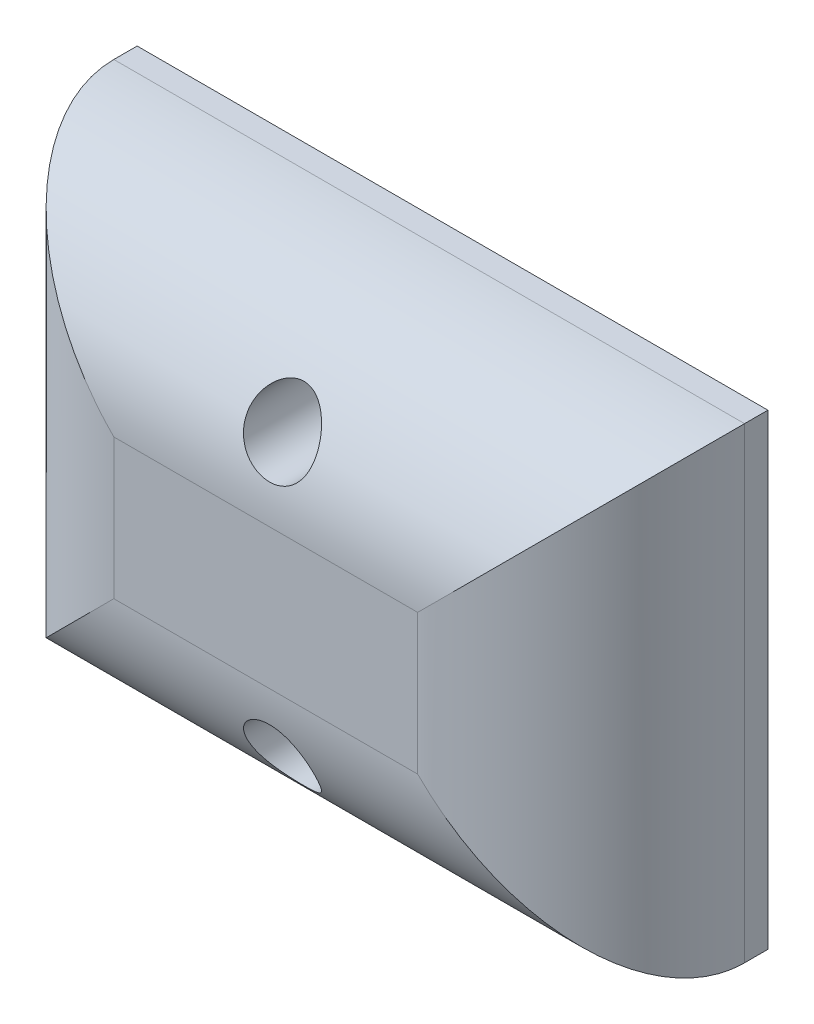
ISO-10303-21;
HEADER;
FILE_DESCRIPTION(('STEP AP214'),'2;1');
FILE_NAME('part.step','',(''),(''),'','','');
FILE_SCHEMA(('AUTOMOTIVE_DESIGN { 1 0 10303 214 1 1 1 1 }'));
ENDSEC;
DATA;
#1=APPLICATION_CONTEXT('core data for automotive mechanical design processes');
#2=APPLICATION_PROTOCOL_DEFINITION('international standard','automotive_design',2000,#1);
#3=PRODUCT_CONTEXT('',#1,'mechanical');
#4=PRODUCT('Part','Part','',(#3));
#5=PRODUCT_RELATED_PRODUCT_CATEGORY('part','',(#4));
#6=PRODUCT_DEFINITION_FORMATION('','',#4);
#7=PRODUCT_DEFINITION_CONTEXT('part definition',#1,'design');
#8=PRODUCT_DEFINITION('design','',#6,#7);
#9=PRODUCT_DEFINITION_SHAPE('','',#8);
#10=(LENGTH_UNIT() NAMED_UNIT(*) SI_UNIT(.MILLI.,.METRE.));
#11=(NAMED_UNIT(*) PLANE_ANGLE_UNIT() SI_UNIT($,.RADIAN.));
#12=(NAMED_UNIT(*) SI_UNIT($,.STERADIAN.) SOLID_ANGLE_UNIT());
#13=UNCERTAINTY_MEASURE_WITH_UNIT(LENGTH_MEASURE(1.E-05),#10,'distance_accuracy_value','');
#14=(GEOMETRIC_REPRESENTATION_CONTEXT(3) GLOBAL_UNCERTAINTY_ASSIGNED_CONTEXT((#13)) GLOBAL_UNIT_ASSIGNED_CONTEXT((#10,
#11,#12)) REPRESENTATION_CONTEXT('',''));
#15=CARTESIAN_POINT('',(0.,0.,0.));
#16=DIRECTION('',(0.,0.,1.));
#17=DIRECTION('',(1.,0.,0.));
#18=AXIS2_PLACEMENT_3D('',#15,#16,#17);
#19=CARTESIAN_POINT('',(67.5347222222222,-50.,40.));
#20=DIRECTION('',(-1.,0.,0.));
#21=DIRECTION('',(0.,0.,1.));
#22=AXIS2_PLACEMENT_3D('',#19,#20,#21);
#23=PLANE('',#22);
#24=DIRECTION('',(0.,1.,0.));
#25=VECTOR('',#24,1.);
#26=CARTESIAN_POINT('',(67.5347222222222,-50.,5.));
#27=LINE('',#26,#25);
#28=CARTESIAN_POINT('',(67.5347222222222,-50.,5.));
#29=VERTEX_POINT('',#28);
#30=CARTESIAN_POINT('',(67.5347222222222,50.,5.));
#31=VERTEX_POINT('',#30);
#32=EDGE_CURVE('E94',#29,#31,#27,.T.);
#33=ORIENTED_EDGE('',*,*,#32,.F.);
#34=DIRECTION('',(0.,0.,-1.));
#35=VECTOR('',#34,1.);
#36=CARTESIAN_POINT('',(67.5347222222222,-50.,40.));
#37=LINE('',#36,#35);
#38=CARTESIAN_POINT('',(67.5347222222222,-50.,0.));
#39=VERTEX_POINT('',#38);
#40=EDGE_CURVE('E60',#29,#39,#37,.T.);
#41=ORIENTED_EDGE('',*,*,#40,.T.);
#42=DIRECTION('',(0.,1.,0.));
#43=VECTOR('',#42,1.);
#44=CARTESIAN_POINT('',(67.5347222222222,-50.,0.));
#45=LINE('',#44,#43);
#46=CARTESIAN_POINT('',(67.5347222222222,50.,0.));
#47=VERTEX_POINT('',#46);
#48=EDGE_CURVE('E193',#39,#47,#45,.T.);
#49=ORIENTED_EDGE('',*,*,#48,.T.);
#50=DIRECTION('',(0.,0.,-1.));
#51=VECTOR('',#50,1.);
#52=CARTESIAN_POINT('',(67.5347222222222,50.,40.));
#53=LINE('',#52,#51);
#54=EDGE_CURVE('E100',#31,#47,#53,.T.);
#55=ORIENTED_EDGE('',*,*,#54,.F.);
#56=EDGE_LOOP('',(#33,#41,#49,#55));
#57=FACE_BOUND('',#56,.T.);
#58=ADVANCED_FACE('F32',(#57),#23,.F.);
#59=CARTESIAN_POINT('',(0.,0.,40.));
#60=DIRECTION('',(0.,0.,1.));
#61=DIRECTION('',(1.,0.,0.));
#62=AXIS2_PLACEMENT_3D('',#59,#60,#61);
#63=PLANE('',#62);
#64=DIRECTION('',(1.,0.,0.));
#65=VECTOR('',#64,1.);
#66=CARTESIAN_POINT('',(-67.5347222222222,-15.,40.));
#67=LINE('',#66,#65);
#68=CARTESIAN_POINT('',(-32.5347222222222,-15.,40.));
#69=VERTEX_POINT('',#68);
#70=CARTESIAN_POINT('',(32.5347222222222,-15.,40.));
#71=VERTEX_POINT('',#70);
#72=EDGE_CURVE('E52',#69,#71,#67,.T.);
#73=ORIENTED_EDGE('',*,*,#72,.T.);
#74=DIRECTION('',(0.,1.,0.));
#75=VECTOR('',#74,1.);
#76=CARTESIAN_POINT('',(32.5347222222222,-50.,40.));
#77=LINE('',#76,#75);
#78=CARTESIAN_POINT('',(32.5347222222222,15.,40.));
#79=VERTEX_POINT('',#78);
#80=EDGE_CURVE('E96',#71,#79,#77,.T.);
#81=ORIENTED_EDGE('',*,*,#80,.T.);
#82=DIRECTION('',(1.,0.,0.));
#83=VECTOR('',#82,1.);
#84=CARTESIAN_POINT('',(-67.5347222222222,15.,40.));
#85=LINE('',#84,#83);
#86=CARTESIAN_POINT('',(-32.5347222222222,15.,40.));
#87=VERTEX_POINT('',#86);
#88=EDGE_CURVE('E191',#87,#79,#85,.T.);
#89=ORIENTED_EDGE('',*,*,#88,.F.);
#90=DIRECTION('',(0.,1.,0.));
#91=VECTOR('',#90,1.);
#92=CARTESIAN_POINT('',(-32.5347222222222,-50.,40.));
#93=LINE('',#92,#91);
#94=EDGE_CURVE('E204',#69,#87,#93,.T.);
#95=ORIENTED_EDGE('',*,*,#94,.F.);
#96=EDGE_LOOP('',(#73,#81,#89,#95));
#97=FACE_BOUND('',#96,.T.);
#98=ADVANCED_FACE('F162',(#97),#63,.T.);
#99=CARTESIAN_POINT('',(-67.5347222222222,15.,5.));
#100=DIRECTION('',(1.,0.,0.));
#101=DIRECTION('',(0.,0.,-1.));
#102=AXIS2_PLACEMENT_3D('',#99,#100,#101);
#103=CYLINDRICAL_SURFACE('',#102,35.);
#104=CARTESIAN_POINT('',(7.5,30.,36.6227766016838));
#105=CARTESIAN_POINT('',(7.49999916443161,29.790232917641,36.7222770861872));
#106=CARTESIAN_POINT('',(7.49119477728935,29.579429460195,36.8197080363041));
#107=CARTESIAN_POINT('',(7.45550013901082,29.1571184853507,37.0098369424833));
#108=CARTESIAN_POINT('',(7.42860193927772,28.945610699192,37.1025327991592));
#109=CARTESIAN_POINT('',(7.35627826191036,28.5231213306105,37.2827819922161));
#110=CARTESIAN_POINT('',(7.31082179021821,28.3121412254244,37.3703264440594));
#111=CARTESIAN_POINT('',(7.20114607772755,27.892758169721,37.5396361787241));
#112=CARTESIAN_POINT('',(7.13692806469736,27.6843550514938,37.6214018392789));
#113=CARTESIAN_POINT('',(6.98943803110547,27.2712637804176,37.7790346209648));
#114=CARTESIAN_POINT('',(6.90610706193821,27.0665892806202,37.8548824996844));
#115=CARTESIAN_POINT('',(6.72065463251747,26.6635330712533,38.0001195363502));
#116=CARTESIAN_POINT('',(6.61853238412301,26.4651516260354,38.0695084232106));
#117=CARTESIAN_POINT('',(6.39596935703217,26.0767826407326,38.2016104730404));
#118=CARTESIAN_POINT('',(6.27554023347453,25.8867898585898,38.2643278405781));
#119=CARTESIAN_POINT('',(6.01697390491499,25.5170426140269,38.3830723749251));
#120=CARTESIAN_POINT('',(5.87883798355347,25.3372874108046,38.4391000261319));
#121=CARTESIAN_POINT('',(5.5955731394145,25.0015470867855,38.5409862376825));
#122=CARTESIAN_POINT('',(5.45152858720825,24.8447762436539,38.5872741732381));
#123=CARTESIAN_POINT('',(5.14974895884271,24.5433005380019,38.6741745081435));
#124=CARTESIAN_POINT('',(4.99201431695489,24.3985952930267,38.7147870874179));
#125=CARTESIAN_POINT('',(4.66397559289687,24.1226478552546,38.7904982778066));
#126=CARTESIAN_POINT('',(4.49367279987639,23.9914042849481,38.8255974532935));
#127=CARTESIAN_POINT('',(4.14173842623571,23.7436182199206,38.8904935203734));
#128=CARTESIAN_POINT('',(3.96010708482611,23.6270754149391,38.9202905238745));
#129=CARTESIAN_POINT('',(3.59476807363196,23.4143774597845,38.9736628571047));
#130=CARTESIAN_POINT('',(3.41147008271662,23.317570343925,38.9974473794923));
#131=CARTESIAN_POINT('',(3.03706013813732,23.1392964148022,39.0405679979049));
#132=CARTESIAN_POINT('',(2.84594839053682,23.0578291973141,39.0599042111511));
#133=CARTESIAN_POINT('',(2.45730268780749,22.9109367870957,39.0943217265486));
#134=CARTESIAN_POINT('',(2.25976922896498,22.8455103580144,39.1094033566373));
#135=CARTESIAN_POINT('',(1.85969742232592,22.7312447051172,39.1354843764716));
#136=CARTESIAN_POINT('',(1.65715906867952,22.68240550069,39.1464837614455));
#137=CARTESIAN_POINT('',(1.25078967377641,22.602165886026,39.164436871357));
#138=CARTESIAN_POINT('',(1.04699702495568,22.5705805122818,39.1714335459592));
#139=CARTESIAN_POINT('',(0.637338439895402,22.524285672601,39.1816572024937));
#140=CARTESIAN_POINT('',(0.43147181488207,22.5095820129078,39.1848828874507));
#141=CARTESIAN_POINT('',(0.0192407242948251,22.4971909092291,39.187602563217));
#142=CARTESIAN_POINT('',(-0.187123642553708,22.4995003302239,39.1870972415431));
#143=CARTESIAN_POINT('',(-0.598917994469745,22.5211092100523,39.1823498020761));
#144=CARTESIAN_POINT('',(-0.804347978974192,22.5404086791227,39.1781076820317));
#145=CARTESIAN_POINT('',(-1.21257496973654,22.59580910117,39.1658379994476));
#146=CARTESIAN_POINT('',(-1.41537472600675,22.6318907554921,39.1578147848337));
#147=CARTESIAN_POINT('',(-1.8171451317034,22.7205560232521,39.1378833074107));
#148=CARTESIAN_POINT('',(-2.01611568368387,22.7731400560564,39.1259749458701));
#149=CARTESIAN_POINT('',(-2.40880464563198,22.8943765555221,39.0981331353639));
#150=CARTESIAN_POINT('',(-2.60252319417469,22.9630285977648,39.0821997927128));
#151=CARTESIAN_POINT('',(-2.98333795699351,23.1158308167833,39.0461370424751));
#152=CARTESIAN_POINT('',(-3.17043434761737,23.1999805804848,39.026007746725));
#153=CARTESIAN_POINT('',(-3.53677815338835,23.3831158842529,38.9813514994481));
#154=CARTESIAN_POINT('',(-3.71602200346857,23.4821080744329,38.9568225757066));
#155=CARTESIAN_POINT('',(-4.06532771428671,23.6940626780297,38.9031741697423));
#156=CARTESIAN_POINT('',(-4.2353895243249,23.807025168574,38.8740546621755));
#157=CARTESIAN_POINT('',(-4.56519402027287,24.0459698806125,38.8110291286595));
#158=CARTESIAN_POINT('',(-4.72493548960455,24.1719536325393,38.7771225398968));
#159=CARTESIAN_POINT('',(-5.03297605170879,24.435805044694,38.704366159004));
#160=CARTESIAN_POINT('',(-5.18127894445742,24.5736687258205,38.6655180199526));
#161=CARTESIAN_POINT('',(-5.46648316531185,24.8610502222671,38.5824685686632));
#162=CARTESIAN_POINT('',(-5.60330578241188,25.0106367290142,38.5382347091576));
#163=CARTESIAN_POINT('',(-5.86368242275903,25.3194004219109,38.4445212019187));
#164=CARTESIAN_POINT('',(-5.98723644683927,25.4785776074583,38.3950415545148));
#165=CARTESIAN_POINT('',(-6.2204105983893,25.8051529136064,38.2908101330523));
#166=CARTESIAN_POINT('',(-6.33003278076222,25.9725498167631,38.2360591385996));
#167=CARTESIAN_POINT('',(-6.53491254501008,26.3142678457131,38.1212898024438));
#168=CARTESIAN_POINT('',(-6.63016495935619,26.4885914340835,38.061269578083));
#169=CARTESIAN_POINT('',(-6.808349706438,26.8475993618755,37.9343531965233));
#170=CARTESIAN_POINT('',(-6.89087106291851,27.0324367958612,37.8673133130962));
#171=CARTESIAN_POINT('',(-7.04019217995104,27.4064952373109,37.7279502436963));
#172=CARTESIAN_POINT('',(-7.10698620433037,27.5957178165995,37.6556251426289));
#173=CARTESIAN_POINT('',(-7.22477824433963,27.9770338490029,37.5059768348536));
#174=CARTESIAN_POINT('',(-7.27577880170447,28.1691268349448,37.4286544348139));
#175=CARTESIAN_POINT('',(-7.36212604631513,28.5549394550415,37.2692920623234));
#176=CARTESIAN_POINT('',(-7.39746681186241,28.7486596763625,37.1872503184953));
#177=CARTESIAN_POINT('',(-7.45453469940997,29.1493839849127,37.0132119343324));
#178=CARTESIAN_POINT('',(-7.47519480723372,29.3564110606075,36.9209163926836));
#179=CARTESIAN_POINT('',(-7.4993146081195,29.7694792168684,36.7319116328313));
#180=CARTESIAN_POINT('',(-7.50276786620895,29.9755198997721,36.6352007770431));
#181=CARTESIAN_POINT('',(-7.4879535639881,30.5901992680037,36.3392995639215));
#182=CARTESIAN_POINT('',(-7.44454698871759,30.9956515678299,36.134229307373));
#183=CARTESIAN_POINT('',(-7.28716758468246,31.828938788763,35.6925319178926));
#184=CARTESIAN_POINT('',(-7.16651112785869,32.254899080194,35.4548093387301));
#185=CARTESIAN_POINT('',(-6.85375771715775,33.0772732256766,34.9739718818209));
#186=CARTESIAN_POINT('',(-6.66159114585757,33.4736578339015,34.7308519671944));
#187=CARTESIAN_POINT('',(-6.31344085963727,34.0555421455214,34.3589129792686));
#188=CARTESIAN_POINT('',(-6.18107725959003,34.2546079570394,34.2286507084729));
#189=CARTESIAN_POINT('',(-5.89694840278302,34.6404072815291,33.9708148350706));
#190=CARTESIAN_POINT('',(-5.74518011686715,34.8271388621566,33.8432416558725));
#191=CARTESIAN_POINT('',(-5.4227773317748,35.1866879029053,33.5927546149269));
#192=CARTESIAN_POINT('',(-5.25215651887567,35.3595153014986,33.4698374589938));
#193=CARTESIAN_POINT('',(-4.892484886805,35.6897494119127,33.2307610074462));
#194=CARTESIAN_POINT('',(-4.70344050714011,35.8471614734929,33.114599373111));
#195=CARTESIAN_POINT('',(-4.21042451684359,36.2175567023365,32.8368753134688));
#196=CARTESIAN_POINT('',(-3.89532024533392,36.4202677111757,32.68075404542));
#197=CARTESIAN_POINT('',(-3.39534729209162,36.6901071369297,32.4691180542504));
#198=CARTESIAN_POINT('',(-3.22418972935859,36.7743299012599,32.4023462499716));
#199=CARTESIAN_POINT('',(-2.87322348320654,36.9304704304036,32.2775442764461));
#200=CARTESIAN_POINT('',(-2.69341606410065,37.0023899865661,32.2195128347488));
#201=CARTESIAN_POINT('',(-2.35485879345302,37.1226177467919,32.1218513415607));
#202=CARTESIAN_POINT('',(-2.19721258774929,37.1728595064197,32.0807628260732));
#203=CARTESIAN_POINT('',(-1.87720884141474,37.2631749221628,32.0065632704373));
#204=CARTESIAN_POINT('',(-1.71485220520355,37.3032505160082,31.9734507100865));
#205=CARTESIAN_POINT('',(-1.38641028422054,37.3726539187469,31.9159133883313));
#206=CARTESIAN_POINT('',(-1.22032665462654,37.4019864022466,31.8914848484205));
#207=CARTESIAN_POINT('',(-0.885467423177314,37.4494657591367,31.8518611492105));
#208=CARTESIAN_POINT('',(-0.716691794452796,37.4676125208088,31.8366660821314));
#209=CARTESIAN_POINT('',(-0.377171163347543,37.4924497819561,31.8158529430957));
#210=CARTESIAN_POINT('',(-0.206421638674256,37.499104097779,31.8102651195302));
#211=CARTESIAN_POINT('',(0.135172446892783,37.5007266863555,31.8089033690546));
#212=CARTESIAN_POINT('',(0.306017007857122,37.4956949504179,31.8131294494434));
#213=CARTESIAN_POINT('',(0.646463046818444,37.4740338963568,31.8312876640555));
#214=CARTESIAN_POINT('',(0.816064393443346,37.4574033699299,31.8452208095117));
#215=CARTESIAN_POINT('',(1.15272298271938,37.4128312034541,31.8824447766232));
#216=CARTESIAN_POINT('',(1.31978023494353,37.3848896059779,31.9057355630581));
#217=CARTESIAN_POINT('',(1.64274621357672,37.3196503541866,31.9598760227467));
#218=CARTESIAN_POINT('',(1.79881762581366,37.2828324475107,31.9903366389522));
#219=CARTESIAN_POINT('',(2.10678151171228,37.1997880128894,32.0586825656671));
#220=CARTESIAN_POINT('',(2.25867268943271,37.1535586037055,32.0965701497372));
#221=CARTESIAN_POINT('',(2.70708506010592,37.0015102703514,32.2204084625814));
#222=CARTESIAN_POINT('',(2.99643769670081,36.8823121197214,32.3165508729344));
#223=CARTESIAN_POINT('',(3.46487229020137,36.6550643618758,32.4967662227107));
#224=CARTESIAN_POINT('',(3.650218948282,36.5551153299399,32.5752643695838));
#225=CARTESIAN_POINT('',(4.00920347042456,36.3419094513695,32.7406037417757));
#226=CARTESIAN_POINT('',(4.18284110444914,36.2286523434021,32.827445130926));
#227=CARTESIAN_POINT('',(4.5180716759399,35.9899448307188,33.0079383876454));
#228=CARTESIAN_POINT('',(4.67965026226169,35.8644802946155,33.1015981158236));
#229=CARTESIAN_POINT('',(4.99021042914277,35.6025940580049,33.2941618721999));
#230=CARTESIAN_POINT('',(5.13919289380484,35.4661731278231,33.3930655315402));
#231=CARTESIAN_POINT('',(5.57056066929332,35.0382805566602,33.6982690845827));
#232=CARTESIAN_POINT('',(5.8332814497193,34.7311206251647,33.9108072261044));
#233=CARTESIAN_POINT('',(6.3044970332695,34.0821837255788,34.3431832420776));
#234=CARTESIAN_POINT('',(6.51295967689173,33.7403863934263,34.5630253590445));
#235=CARTESIAN_POINT('',(6.79897990936739,33.1747534627324,34.9121933606278));
#236=CARTESIAN_POINT('',(6.89512734615897,32.9601659366833,35.0415890090888));
#237=CARTESIAN_POINT('',(7.06711623439328,32.5221469139376,35.2991557221818));
#238=CARTESIAN_POINT('',(7.14295235124508,32.2987131114954,35.4273264565938));
#239=CARTESIAN_POINT('',(7.27337186342945,31.844908054132,35.6808819434673));
#240=CARTESIAN_POINT('',(7.32800271612051,31.6145535482181,35.8062723179171));
#241=CARTESIAN_POINT('',(7.41542266733173,31.1479467731451,36.0533960678856));
#242=CARTESIAN_POINT('',(7.44822607243486,30.9116984725901,36.1751317887406));
#243=CARTESIAN_POINT('',(7.47975528311974,30.5619401166865,36.3503042738552));
#244=CARTESIAN_POINT('',(7.48732562983698,30.450086989249,36.4055792338376));
#245=CARTESIAN_POINT('',(7.49744868611085,30.225589488853,36.515028460384));
#246=CARTESIAN_POINT('',(7.50000044989541,30.1129449707671,36.569202517575));
#247=CARTESIAN_POINT('',(7.5,30.,36.6227766016838));
#248=B_SPLINE_CURVE_WITH_KNOTS('',3,(#104,#105,#106,#107,#108,#109,#110,#111,#112,#113,#114,
#115,#116,#117,#118,#119,#120,#121,#122,#123,#124,#125,#126,#127,#128,#129,#130,#131,#132,#133,
#134,#135,#136,#137,#138,#139,#140,#141,#142,#143,#144,#145,#146,#147,#148,#149,#150,#151,#152,
#153,#154,#155,#156,#157,#158,#159,#160,#161,#162,#163,#164,#165,#166,#167,#168,#169,#170,#171,
#172,#173,#174,#175,#176,#177,#178,#179,#180,#181,#182,#183,#184,#185,#186,#187,#188,#189,#190,
#191,#192,#193,#194,#195,#196,#197,#198,#199,#200,#201,#202,#203,#204,#205,#206,#207,#208,#209,
#210,#211,#212,#213,#214,#215,#216,#217,#218,#219,#220,#221,#222,#223,#224,#225,#226,#227,#228,
#229,#230,#231,#232,#233,#234,#235,#236,#237,#238,#239,#240,#241,#242,#243,#244,#245,#246,#247),
.UNSPECIFIED.,.T.,.F.,(4,2,2,2,2,2,2,2,2,2,2,2,2,2,2,2,2,2,2,2,2,2,2,2,2,2,2,2,2,2,2,2,2,2,2,2,
2,2,2,2,2,2,2,2,2,2,2,2,2,2,2,2,2,2,2,2,2,2,2,2,2,2,2,2,2,2,2,2,2,2,2,4),(0.,0.696404120689823,
1.39311437109538,2.09099298416344,2.78882593779492,3.48884081514133,4.1888850591008,
4.88848546962594,5.58803519182183,6.24083183846742,6.89360778492543,7.54631686717971,
8.19901217166646,8.82421622140558,9.44940379395853,10.0745431647358,10.6996832662278,
11.3179832523498,11.9364958309719,12.5548944384262,13.1732934184769,13.7909830228659,
14.4086883255507,15.0263773140749,15.6440498411764,16.2619999465567,16.8799534636731,
17.4979796937121,18.1157997187576,18.7375582957506,19.3593168337041,19.9809835575184,
20.6028733094284,21.2418699654927,21.8810993207231,22.5202257475111,23.159593652023,
23.8416686757023,24.5239987608778,25.8878231191662,27.3893766769037,28.8923958865571,
29.7082995109867,30.524330657391,31.3397732382974,32.1549318165125,33.3670895144712,
33.9728220283266,34.5784662722349,35.0894086334178,35.6002535327261,36.1108758853238,
36.6215033377218,37.1337355756253,37.64596819449,38.1582541831335,38.6705382436523,
39.1596770646722,39.6489658565046,40.6272585789362,41.3007002682728,41.9741551842995,
42.648399186891,43.3225958259582,44.6873645502451,46.0529403579994,46.8573181502219,
47.661906998543,48.4646846502629,49.2669356097111,49.6418301044354,50.0167952427635),.UNSPECIFIED.);
#249=CARTESIAN_POINT('',(7.5,30.,36.6227766016838));
#250=VERTEX_POINT('',#249);
#251=EDGE_CURVE('E35',#250,#250,#248,.T.);
#252=ORIENTED_EDGE('',*,*,#251,.T.);
#253=EDGE_LOOP('',(#252));
#254=FACE_BOUND('',#253,.T.);
#255=CARTESIAN_POINT('',(32.5347222222222,15.,5.));
#256=DIRECTION('',(0.707106781186547,-0.707106781186547,0.));
#257=DIRECTION('',(0.707106781186547,0.707106781186547,0.));
#258=AXIS2_PLACEMENT_3D('',#255,#256,#257);
#259=ELLIPSE('',#258,49.4974746830583,35.);
#260=EDGE_CURVE('E101',#31,#79,#259,.T.);
#261=ORIENTED_EDGE('',*,*,#260,.F.);
#262=DIRECTION('',(1.,0.,0.));
#263=VECTOR('',#262,1.);
#264=CARTESIAN_POINT('',(-67.5347222222222,50.,5.));
#265=LINE('',#264,#263);
#266=CARTESIAN_POINT('',(-67.5347222222222,50.,5.));
#267=VERTEX_POINT('',#266);
#268=EDGE_CURVE('E109',#267,#31,#265,.T.);
#269=ORIENTED_EDGE('',*,*,#268,.F.);
#270=CARTESIAN_POINT('',(-32.5347222222222,15.,5.));
#271=DIRECTION('',(0.707106781186547,0.707106781186547,0.));
#272=DIRECTION('',(0.707106781186547,-0.707106781186547,0.));
#273=AXIS2_PLACEMENT_3D('',#270,#271,#272);
#274=ELLIPSE('',#273,49.4974746830583,35.);
#275=EDGE_CURVE('E206',#267,#87,#274,.T.);
#276=ORIENTED_EDGE('',*,*,#275,.T.);
#277=ORIENTED_EDGE('',*,*,#88,.T.);
#278=EDGE_LOOP('',(#261,#269,#276,#277));
#279=FACE_BOUND('',#278,.T.);
#280=ADVANCED_FACE('F166',(#254,#279),#103,.T.);
#281=CARTESIAN_POINT('',(-67.5347222222222,-15.,5.));
#282=DIRECTION('',(1.,0.,0.));
#283=DIRECTION('',(0.,0.,-1.));
#284=AXIS2_PLACEMENT_3D('',#281,#282,#283);
#285=CYLINDRICAL_SURFACE('',#284,35.);
#286=CARTESIAN_POINT('',(7.5,-30.,36.6227766016838));
#287=CARTESIAN_POINT('',(7.49999916443161,-29.790232917641,36.7222770861872));
#288=CARTESIAN_POINT('',(7.49119477728935,-29.579429460195,36.8197080363041));
#289=CARTESIAN_POINT('',(7.45550013901082,-29.1571184853507,37.0098369424833));
#290=CARTESIAN_POINT('',(7.42860193927772,-28.945610699192,37.1025327991592));
#291=CARTESIAN_POINT('',(7.35627826191036,-28.5231213306105,37.2827819922161));
#292=CARTESIAN_POINT('',(7.31082179021821,-28.3121412254244,37.3703264440594));
#293=CARTESIAN_POINT('',(7.20114607772755,-27.892758169721,37.5396361787241));
#294=CARTESIAN_POINT('',(7.13692806469736,-27.6843550514938,37.6214018392789));
#295=CARTESIAN_POINT('',(6.98943803110547,-27.2712637804176,37.7790346209648));
#296=CARTESIAN_POINT('',(6.90610706193821,-27.0665892806202,37.8548824996844));
#297=CARTESIAN_POINT('',(6.72065463251747,-26.6635330712533,38.0001195363502));
#298=CARTESIAN_POINT('',(6.61853238412301,-26.4651516260354,38.0695084232106));
#299=CARTESIAN_POINT('',(6.39596935703217,-26.0767826407326,38.2016104730404));
#300=CARTESIAN_POINT('',(6.27554023347453,-25.8867898585898,38.2643278405781));
#301=CARTESIAN_POINT('',(6.01697390491499,-25.5170426140269,38.3830723749251));
#302=CARTESIAN_POINT('',(5.87883798355347,-25.3372874108046,38.4391000261319));
#303=CARTESIAN_POINT('',(5.5955731394145,-25.0015470867855,38.5409862376825));
#304=CARTESIAN_POINT('',(5.45152858720825,-24.8447762436539,38.5872741732381));
#305=CARTESIAN_POINT('',(5.14974895884271,-24.5433005380019,38.6741745081435));
#306=CARTESIAN_POINT('',(4.99201431695489,-24.3985952930267,38.7147870874179));
#307=CARTESIAN_POINT('',(4.66397559289687,-24.1226478552546,38.7904982778066));
#308=CARTESIAN_POINT('',(4.49367279987639,-23.9914042849481,38.8255974532935));
#309=CARTESIAN_POINT('',(4.14173842623571,-23.7436182199206,38.8904935203734));
#310=CARTESIAN_POINT('',(3.96010708482611,-23.6270754149391,38.9202905238745));
#311=CARTESIAN_POINT('',(3.59476807363196,-23.4143774597845,38.9736628571047));
#312=CARTESIAN_POINT('',(3.41147008271662,-23.317570343925,38.9974473794923));
#313=CARTESIAN_POINT('',(3.03706013813732,-23.1392964148022,39.0405679979049));
#314=CARTESIAN_POINT('',(2.84594839053682,-23.0578291973141,39.0599042111511));
#315=CARTESIAN_POINT('',(2.45730268780749,-22.9109367870957,39.0943217265486));
#316=CARTESIAN_POINT('',(2.25976922896498,-22.8455103580144,39.1094033566373));
#317=CARTESIAN_POINT('',(1.85969742232592,-22.7312447051172,39.1354843764716));
#318=CARTESIAN_POINT('',(1.65715906867952,-22.68240550069,39.1464837614455));
#319=CARTESIAN_POINT('',(1.25078967377641,-22.602165886026,39.164436871357));
#320=CARTESIAN_POINT('',(1.04699702495568,-22.5705805122818,39.1714335459592));
#321=CARTESIAN_POINT('',(0.637338439895402,-22.524285672601,39.1816572024937));
#322=CARTESIAN_POINT('',(0.43147181488207,-22.5095820129078,39.1848828874507));
#323=CARTESIAN_POINT('',(0.0192407242948251,-22.4971909092291,39.187602563217));
#324=CARTESIAN_POINT('',(-0.187123642553708,-22.4995003302239,39.1870972415431));
#325=CARTESIAN_POINT('',(-0.598917994469745,-22.5211092100523,39.1823498020761));
#326=CARTESIAN_POINT('',(-0.804347978974192,-22.5404086791227,39.1781076820317));
#327=CARTESIAN_POINT('',(-1.21257496973654,-22.59580910117,39.1658379994476));
#328=CARTESIAN_POINT('',(-1.41537472600675,-22.6318907554921,39.1578147848337));
#329=CARTESIAN_POINT('',(-1.8171451317034,-22.7205560232521,39.1378833074107));
#330=CARTESIAN_POINT('',(-2.01611568368387,-22.7731400560564,39.1259749458701));
#331=CARTESIAN_POINT('',(-2.40880464563198,-22.8943765555221,39.0981331353639));
#332=CARTESIAN_POINT('',(-2.60252319417469,-22.9630285977648,39.0821997927128));
#333=CARTESIAN_POINT('',(-2.98333795699351,-23.1158308167833,39.0461370424751));
#334=CARTESIAN_POINT('',(-3.17043434761737,-23.1999805804848,39.026007746725));
#335=CARTESIAN_POINT('',(-3.53677815338835,-23.3831158842529,38.9813514994481));
#336=CARTESIAN_POINT('',(-3.71602200346857,-23.4821080744329,38.9568225757066));
#337=CARTESIAN_POINT('',(-4.06532771428671,-23.6940626780297,38.9031741697423));
#338=CARTESIAN_POINT('',(-4.2353895243249,-23.807025168574,38.8740546621755));
#339=CARTESIAN_POINT('',(-4.56519402027287,-24.0459698806125,38.8110291286595));
#340=CARTESIAN_POINT('',(-4.72493548960455,-24.1719536325393,38.7771225398968));
#341=CARTESIAN_POINT('',(-5.03297605170879,-24.435805044694,38.704366159004));
#342=CARTESIAN_POINT('',(-5.18127894445742,-24.5736687258205,38.6655180199526));
#343=CARTESIAN_POINT('',(-5.46648316531185,-24.8610502222671,38.5824685686632));
#344=CARTESIAN_POINT('',(-5.60330578241188,-25.0106367290142,38.5382347091576));
#345=CARTESIAN_POINT('',(-5.86368242275903,-25.3194004219109,38.4445212019187));
#346=CARTESIAN_POINT('',(-5.98723644683927,-25.4785776074583,38.3950415545148));
#347=CARTESIAN_POINT('',(-6.2204105983893,-25.8051529136064,38.2908101330523));
#348=CARTESIAN_POINT('',(-6.33003278076222,-25.9725498167631,38.2360591385996));
#349=CARTESIAN_POINT('',(-6.53491254501008,-26.3142678457131,38.1212898024438));
#350=CARTESIAN_POINT('',(-6.63016495935619,-26.4885914340835,38.061269578083));
#351=CARTESIAN_POINT('',(-6.808349706438,-26.8475993618755,37.9343531965233));
#352=CARTESIAN_POINT('',(-6.89087106291851,-27.0324367958612,37.8673133130962));
#353=CARTESIAN_POINT('',(-7.04019217995104,-27.4064952373109,37.7279502436963));
#354=CARTESIAN_POINT('',(-7.10698620433037,-27.5957178165995,37.6556251426289));
#355=CARTESIAN_POINT('',(-7.22477824433963,-27.9770338490029,37.5059768348536));
#356=CARTESIAN_POINT('',(-7.27577880170447,-28.1691268349448,37.4286544348139));
#357=CARTESIAN_POINT('',(-7.36212604631513,-28.5549394550415,37.2692920623234));
#358=CARTESIAN_POINT('',(-7.39746681186241,-28.7486596763625,37.1872503184953));
#359=CARTESIAN_POINT('',(-7.45453469940997,-29.1493839849127,37.0132119343324));
#360=CARTESIAN_POINT('',(-7.47519480723372,-29.3564110606075,36.9209163926836));
#361=CARTESIAN_POINT('',(-7.4993146081195,-29.7694792168684,36.7319116328313));
#362=CARTESIAN_POINT('',(-7.50276786620895,-29.9755198997721,36.6352007770431));
#363=CARTESIAN_POINT('',(-7.4879535639881,-30.5901992680037,36.3392995639215));
#364=CARTESIAN_POINT('',(-7.44454698871759,-30.9956515678299,36.134229307373));
#365=CARTESIAN_POINT('',(-7.28716758468246,-31.828938788763,35.6925319178926));
#366=CARTESIAN_POINT('',(-7.16651112785869,-32.254899080194,35.4548093387301));
#367=CARTESIAN_POINT('',(-6.85375771715775,-33.0772732256766,34.9739718818209));
#368=CARTESIAN_POINT('',(-6.66159114585757,-33.4736578339015,34.7308519671944));
#369=CARTESIAN_POINT('',(-6.31344085963727,-34.0555421455214,34.3589129792686));
#370=CARTESIAN_POINT('',(-6.18107725959003,-34.2546079570394,34.2286507084729));
#371=CARTESIAN_POINT('',(-5.89694840278302,-34.6404072815291,33.9708148350706));
#372=CARTESIAN_POINT('',(-5.74518011686715,-34.8271388621566,33.8432416558725));
#373=CARTESIAN_POINT('',(-5.4227773317748,-35.1866879029053,33.5927546149269));
#374=CARTESIAN_POINT('',(-5.25215651887567,-35.3595153014986,33.4698374589938));
#375=CARTESIAN_POINT('',(-4.892484886805,-35.6897494119127,33.2307610074462));
#376=CARTESIAN_POINT('',(-4.70344050714011,-35.8471614734929,33.114599373111));
#377=CARTESIAN_POINT('',(-4.21042451684359,-36.2175567023365,32.8368753134688));
#378=CARTESIAN_POINT('',(-3.89532024533392,-36.4202677111757,32.68075404542));
#379=CARTESIAN_POINT('',(-3.39534729209162,-36.6901071369297,32.4691180542504));
#380=CARTESIAN_POINT('',(-3.22418972935859,-36.7743299012599,32.4023462499716));
#381=CARTESIAN_POINT('',(-2.87322348320654,-36.9304704304036,32.2775442764461));
#382=CARTESIAN_POINT('',(-2.69341606410065,-37.0023899865661,32.2195128347488));
#383=CARTESIAN_POINT('',(-2.35485879345302,-37.1226177467919,32.1218513415607));
#384=CARTESIAN_POINT('',(-2.19721258774929,-37.1728595064197,32.0807628260732));
#385=CARTESIAN_POINT('',(-1.87720884141474,-37.2631749221628,32.0065632704373));
#386=CARTESIAN_POINT('',(-1.71485220520355,-37.3032505160082,31.9734507100865));
#387=CARTESIAN_POINT('',(-1.38641028422054,-37.3726539187469,31.9159133883313));
#388=CARTESIAN_POINT('',(-1.22032665462654,-37.4019864022466,31.8914848484205));
#389=CARTESIAN_POINT('',(-0.885467423177314,-37.4494657591367,31.8518611492105));
#390=CARTESIAN_POINT('',(-0.716691794452796,-37.4676125208088,31.8366660821314));
#391=CARTESIAN_POINT('',(-0.377171163347543,-37.4924497819561,31.8158529430957));
#392=CARTESIAN_POINT('',(-0.206421638674256,-37.499104097779,31.8102651195302));
#393=CARTESIAN_POINT('',(0.135172446892783,-37.5007266863555,31.8089033690546));
#394=CARTESIAN_POINT('',(0.306017007857122,-37.4956949504179,31.8131294494434));
#395=CARTESIAN_POINT('',(0.646463046818444,-37.4740338963568,31.8312876640555));
#396=CARTESIAN_POINT('',(0.816064393443346,-37.4574033699299,31.8452208095117));
#397=CARTESIAN_POINT('',(1.15272298271938,-37.4128312034541,31.8824447766232));
#398=CARTESIAN_POINT('',(1.31978023494353,-37.3848896059779,31.9057355630581));
#399=CARTESIAN_POINT('',(1.64274621357672,-37.3196503541866,31.9598760227467));
#400=CARTESIAN_POINT('',(1.79881762581366,-37.2828324475107,31.9903366389522));
#401=CARTESIAN_POINT('',(2.10678151171228,-37.1997880128894,32.0586825656671));
#402=CARTESIAN_POINT('',(2.25867268943271,-37.1535586037055,32.0965701497372));
#403=CARTESIAN_POINT('',(2.70708506010592,-37.0015102703514,32.2204084625814));
#404=CARTESIAN_POINT('',(2.99643769670081,-36.8823121197214,32.3165508729344));
#405=CARTESIAN_POINT('',(3.46487229020137,-36.6550643618758,32.4967662227107));
#406=CARTESIAN_POINT('',(3.650218948282,-36.5551153299399,32.5752643695838));
#407=CARTESIAN_POINT('',(4.00920347042456,-36.3419094513695,32.7406037417757));
#408=CARTESIAN_POINT('',(4.18284110444914,-36.2286523434021,32.827445130926));
#409=CARTESIAN_POINT('',(4.5180716759399,-35.9899448307188,33.0079383876454));
#410=CARTESIAN_POINT('',(4.67965026226169,-35.8644802946155,33.1015981158236));
#411=CARTESIAN_POINT('',(4.99021042914277,-35.6025940580049,33.2941618721999));
#412=CARTESIAN_POINT('',(5.13919289380484,-35.4661731278231,33.3930655315402));
#413=CARTESIAN_POINT('',(5.57056066929332,-35.0382805566602,33.6982690845827));
#414=CARTESIAN_POINT('',(5.8332814497193,-34.7311206251647,33.9108072261044));
#415=CARTESIAN_POINT('',(6.3044970332695,-34.0821837255788,34.3431832420776));
#416=CARTESIAN_POINT('',(6.51295967689173,-33.7403863934263,34.5630253590445));
#417=CARTESIAN_POINT('',(6.79897990936739,-33.1747534627324,34.9121933606278));
#418=CARTESIAN_POINT('',(6.89512734615897,-32.9601659366833,35.0415890090888));
#419=CARTESIAN_POINT('',(7.06711623439328,-32.5221469139376,35.2991557221818));
#420=CARTESIAN_POINT('',(7.14295235124508,-32.2987131114954,35.4273264565938));
#421=CARTESIAN_POINT('',(7.27337186342945,-31.844908054132,35.6808819434673));
#422=CARTESIAN_POINT('',(7.32800271612051,-31.6145535482181,35.8062723179171));
#423=CARTESIAN_POINT('',(7.41542266733173,-31.1479467731451,36.0533960678856));
#424=CARTESIAN_POINT('',(7.44822607243486,-30.9116984725901,36.1751317887406));
#425=CARTESIAN_POINT('',(7.47975528311974,-30.5619401166865,36.3503042738552));
#426=CARTESIAN_POINT('',(7.48732562983698,-30.450086989249,36.4055792338376));
#427=CARTESIAN_POINT('',(7.49744868611085,-30.225589488853,36.515028460384));
#428=CARTESIAN_POINT('',(7.50000044989541,-30.1129449707671,36.569202517575));
#429=CARTESIAN_POINT('',(7.5,-30.,36.6227766016838));
#430=B_SPLINE_CURVE_WITH_KNOTS('',3,(#286,#287,#288,#289,#290,#291,#292,#293,#294,#295,#296,
#297,#298,#299,#300,#301,#302,#303,#304,#305,#306,#307,#308,#309,#310,#311,#312,#313,#314,#315,
#316,#317,#318,#319,#320,#321,#322,#323,#324,#325,#326,#327,#328,#329,#330,#331,#332,#333,#334,
#335,#336,#337,#338,#339,#340,#341,#342,#343,#344,#345,#346,#347,#348,#349,#350,#351,#352,#353,
#354,#355,#356,#357,#358,#359,#360,#361,#362,#363,#364,#365,#366,#367,#368,#369,#370,#371,#372,
#373,#374,#375,#376,#377,#378,#379,#380,#381,#382,#383,#384,#385,#386,#387,#388,#389,#390,#391,
#392,#393,#394,#395,#396,#397,#398,#399,#400,#401,#402,#403,#404,#405,#406,#407,#408,#409,#410,
#411,#412,#413,#414,#415,#416,#417,#418,#419,#420,#421,#422,#423,#424,#425,#426,#427,#428,#429),
.UNSPECIFIED.,.T.,.F.,(4,2,2,2,2,2,2,2,2,2,2,2,2,2,2,2,2,2,2,2,2,2,2,2,2,2,2,2,2,2,2,2,2,2,2,2,
2,2,2,2,2,2,2,2,2,2,2,2,2,2,2,2,2,2,2,2,2,2,2,2,2,2,2,2,2,2,2,2,2,2,2,4),(0.,0.696404120689823,
1.39311437109538,2.09099298416344,2.78882593779492,3.48884081514133,4.1888850591008,
4.88848546962594,5.58803519182183,6.24083183846742,6.89360778492543,7.54631686717971,
8.19901217166646,8.82421622140558,9.44940379395853,10.0745431647358,10.6996832662278,
11.3179832523498,11.9364958309719,12.5548944384262,13.1732934184769,13.7909830228659,
14.4086883255507,15.0263773140749,15.6440498411764,16.2619999465567,16.8799534636731,
17.4979796937121,18.1157997187576,18.7375582957506,19.3593168337041,19.9809835575184,
20.6028733094284,21.2418699654927,21.8810993207231,22.5202257475111,23.159593652023,
23.8416686757023,24.5239987608778,25.8878231191662,27.3893766769037,28.8923958865571,
29.7082995109867,30.524330657391,31.3397732382974,32.1549318165125,33.3670895144712,
33.9728220283266,34.5784662722349,35.0894086334178,35.6002535327261,36.1108758853238,
36.6215033377218,37.1337355756253,37.64596819449,38.1582541831335,38.6705382436523,
39.1596770646722,39.6489658565046,40.6272585789362,41.3007002682728,41.9741551842995,
42.648399186891,43.3225958259582,44.6873645502451,46.0529403579994,46.8573181502219,
47.661906998543,48.4646846502629,49.2669356097111,49.6418301044354,50.0167952427635),.UNSPECIFIED.);
#431=CARTESIAN_POINT('',(7.5,-30.,36.6227766016838));
#432=VERTEX_POINT('',#431);
#433=EDGE_CURVE('E125',#432,#432,#430,.T.);
#434=ORIENTED_EDGE('',*,*,#433,.F.);
#435=EDGE_LOOP('',(#434));
#436=FACE_BOUND('',#435,.T.);
#437=DIRECTION('',(1.,0.,0.));
#438=VECTOR('',#437,1.);
#439=CARTESIAN_POINT('',(-67.5347222222222,-50.,5.));
#440=LINE('',#439,#438);
#441=CARTESIAN_POINT('',(-67.5347222222222,-50.,5.));
#442=VERTEX_POINT('',#441);
#443=EDGE_CURVE('E105',#442,#29,#440,.T.);
#444=ORIENTED_EDGE('',*,*,#443,.T.);
#445=CARTESIAN_POINT('',(32.5347222222222,-15.,5.));
#446=DIRECTION('',(0.707106781186547,0.707106781186547,0.));
#447=DIRECTION('',(0.707106781186547,-0.707106781186547,0.));
#448=AXIS2_PLACEMENT_3D('',#445,#446,#447);
#449=ELLIPSE('',#448,49.4974746830583,35.);
#450=EDGE_CURVE('E11',#29,#71,#449,.F.);
#451=ORIENTED_EDGE('',*,*,#450,.T.);
#452=ORIENTED_EDGE('',*,*,#72,.F.);
#453=CARTESIAN_POINT('',(-32.5347222222222,-15.,5.));
#454=DIRECTION('',(0.707106781186547,-0.707106781186547,0.));
#455=DIRECTION('',(0.707106781186547,0.707106781186547,0.));
#456=AXIS2_PLACEMENT_3D('',#453,#454,#455);
#457=ELLIPSE('',#456,49.4974746830583,35.);
#458=EDGE_CURVE('E44',#442,#69,#457,.F.);
#459=ORIENTED_EDGE('',*,*,#458,.F.);
#460=EDGE_LOOP('',(#444,#451,#452,#459));
#461=FACE_BOUND('',#460,.T.);
#462=ADVANCED_FACE('F106',(#436,#461),#285,.T.);
#463=CARTESIAN_POINT('',(-67.5347222222222,-50.,40.));
#464=DIRECTION('',(-1.,0.,0.));
#465=DIRECTION('',(0.,0.,1.));
#466=AXIS2_PLACEMENT_3D('',#463,#464,#465);
#467=PLANE('',#466);
#468=DIRECTION('',(0.,1.,0.));
#469=VECTOR('',#468,1.);
#470=CARTESIAN_POINT('',(-67.5347222222222,-50.,5.));
#471=LINE('',#470,#469);
#472=EDGE_CURVE('E203',#442,#267,#471,.T.);
#473=ORIENTED_EDGE('',*,*,#472,.T.);
#474=DIRECTION('',(0.,0.,-1.));
#475=VECTOR('',#474,1.);
#476=CARTESIAN_POINT('',(-67.5347222222222,50.,40.));
#477=LINE('',#476,#475);
#478=CARTESIAN_POINT('',(-67.5347222222222,50.,0.));
#479=VERTEX_POINT('',#478);
#480=EDGE_CURVE('E117',#267,#479,#477,.T.);
#481=ORIENTED_EDGE('',*,*,#480,.T.);
#482=DIRECTION('',(0.,1.,0.));
#483=VECTOR('',#482,1.);
#484=CARTESIAN_POINT('',(-67.5347222222222,-50.,0.));
#485=LINE('',#484,#483);
#486=CARTESIAN_POINT('',(-67.5347222222222,-50.,0.));
#487=VERTEX_POINT('',#486);
#488=EDGE_CURVE('E119',#487,#479,#485,.T.);
#489=ORIENTED_EDGE('',*,*,#488,.F.);
#490=DIRECTION('',(0.,0.,-1.));
#491=VECTOR('',#490,1.);
#492=CARTESIAN_POINT('',(-67.5347222222222,-50.,40.));
#493=LINE('',#492,#491);
#494=EDGE_CURVE('E115',#442,#487,#493,.T.);
#495=ORIENTED_EDGE('',*,*,#494,.F.);
#496=EDGE_LOOP('',(#473,#481,#489,#495));
#497=FACE_BOUND('',#496,.T.);
#498=ADVANCED_FACE('F177',(#497),#467,.T.);
#499=CARTESIAN_POINT('',(67.5347222222222,50.,40.));
#500=DIRECTION('',(0.,-1.,0.));
#501=DIRECTION('',(0.,0.,-1.));
#502=AXIS2_PLACEMENT_3D('',#499,#500,#501);
#503=PLANE('',#502);
#504=ORIENTED_EDGE('',*,*,#268,.T.);
#505=ORIENTED_EDGE('',*,*,#54,.T.);
#506=DIRECTION('',(-1.,0.,0.));
#507=VECTOR('',#506,1.);
#508=CARTESIAN_POINT('',(67.5347222222222,50.,0.));
#509=LINE('',#508,#507);
#510=EDGE_CURVE('E198',#47,#479,#509,.T.);
#511=ORIENTED_EDGE('',*,*,#510,.T.);
#512=ORIENTED_EDGE('',*,*,#480,.F.);
#513=EDGE_LOOP('',(#504,#505,#511,#512));
#514=FACE_BOUND('',#513,.T.);
#515=ADVANCED_FACE('F176',(#514),#503,.F.);
#516=CARTESIAN_POINT('',(67.5347222222222,-50.,40.));
#517=DIRECTION('',(0.,-1.,0.));
#518=DIRECTION('',(1.,0.,0.));
#519=AXIS2_PLACEMENT_3D('',#516,#517,#518);
#520=PLANE('',#519);
#521=ORIENTED_EDGE('',*,*,#443,.F.);
#522=ORIENTED_EDGE('',*,*,#494,.T.);
#523=DIRECTION('',(-1.,0.,0.));
#524=VECTOR('',#523,1.);
#525=CARTESIAN_POINT('',(67.5347222222222,-50.,0.));
#526=LINE('',#525,#524);
#527=EDGE_CURVE('E114',#39,#487,#526,.T.);
#528=ORIENTED_EDGE('',*,*,#527,.F.);
#529=ORIENTED_EDGE('',*,*,#40,.F.);
#530=EDGE_LOOP('',(#521,#522,#528,#529));
#531=FACE_BOUND('',#530,.T.);
#532=ADVANCED_FACE('F112',(#531),#520,.T.);
#533=CARTESIAN_POINT('',(0.,0.,0.));
#534=DIRECTION('',(0.,0.,1.));
#535=DIRECTION('',(1.,0.,0.));
#536=AXIS2_PLACEMENT_3D('',#533,#534,#535);
#537=PLANE('',#536);
#538=CARTESIAN_POINT('',(0.,30.,0.));
#539=DIRECTION('',(0.,0.,1.));
#540=DIRECTION('',(1.,0.,0.));
#541=AXIS2_PLACEMENT_3D('',#538,#539,#540);
#542=CIRCLE('',#541,4.49999999999999);
#543=CARTESIAN_POINT('',(4.49999999999999,30.,0.));
#544=VERTEX_POINT('',#543);
#545=EDGE_CURVE('E221',#544,#544,#542,.T.);
#546=ORIENTED_EDGE('',*,*,#545,.T.);
#547=EDGE_LOOP('',(#546));
#548=FACE_BOUND('',#547,.T.);
#549=CARTESIAN_POINT('',(0.,-30.,0.));
#550=DIRECTION('',(0.,0.,1.));
#551=DIRECTION('',(1.,0.,0.));
#552=AXIS2_PLACEMENT_3D('',#549,#550,#551);
#553=CIRCLE('',#552,4.49999999999999);
#554=CARTESIAN_POINT('',(4.49999999999999,-30.,0.));
#555=VERTEX_POINT('',#554);
#556=EDGE_CURVE('E131',#555,#555,#553,.T.);
#557=ORIENTED_EDGE('',*,*,#556,.T.);
#558=EDGE_LOOP('',(#557));
#559=FACE_BOUND('',#558,.T.);
#560=ORIENTED_EDGE('',*,*,#48,.F.);
#561=ORIENTED_EDGE('',*,*,#527,.T.);
#562=ORIENTED_EDGE('',*,*,#488,.T.);
#563=ORIENTED_EDGE('',*,*,#510,.F.);
#564=EDGE_LOOP('',(#560,#561,#562,#563));
#565=FACE_BOUND('',#564,.T.);
#566=ADVANCED_FACE('F154',(#548,#559,#565),#537,.F.);
#567=CARTESIAN_POINT('',(-32.5347222222222,-50.,5.));
#568=DIRECTION('',(0.,1.,0.));
#569=DIRECTION('',(0.,0.,1.));
#570=AXIS2_PLACEMENT_3D('',#567,#568,#569);
#571=CYLINDRICAL_SURFACE('',#570,35.);
#572=ORIENTED_EDGE('',*,*,#472,.F.);
#573=ORIENTED_EDGE('',*,*,#458,.T.);
#574=ORIENTED_EDGE('',*,*,#94,.T.);
#575=ORIENTED_EDGE('',*,*,#275,.F.);
#576=EDGE_LOOP('',(#572,#573,#574,#575));
#577=FACE_BOUND('',#576,.T.);
#578=ADVANCED_FACE('F152',(#577),#571,.T.);
#579=CARTESIAN_POINT('',(32.5347222222222,-50.,5.));
#580=DIRECTION('',(0.,1.,0.));
#581=DIRECTION('',(0.,0.,1.));
#582=AXIS2_PLACEMENT_3D('',#579,#580,#581);
#583=CYLINDRICAL_SURFACE('',#582,35.);
#584=ORIENTED_EDGE('',*,*,#260,.T.);
#585=ORIENTED_EDGE('',*,*,#80,.F.);
#586=ORIENTED_EDGE('',*,*,#450,.F.);
#587=ORIENTED_EDGE('',*,*,#32,.T.);
#588=EDGE_LOOP('',(#584,#585,#586,#587));
#589=FACE_BOUND('',#588,.T.);
#590=ADVANCED_FACE('F93',(#589),#583,.T.);
#591=CARTESIAN_POINT('',(0.,-30.,40.));
#592=DIRECTION('',(0.,0.,1.));
#593=DIRECTION('',(1.,0.,0.));
#594=AXIS2_PLACEMENT_3D('',#591,#592,#593);
#595=CYLINDRICAL_SURFACE('',#594,4.49999999999999);
#596=ORIENTED_EDGE('',*,*,#556,.F.);
#597=EDGE_LOOP('',(#596));
#598=FACE_BOUND('',#597,.T.);
#599=CARTESIAN_POINT('',(0.,-30.,5.));
#600=DIRECTION('',(0.,0.,1.));
#601=DIRECTION('',(1.,0.,0.));
#602=AXIS2_PLACEMENT_3D('',#599,#600,#601);
#603=CIRCLE('',#602,4.49999999999999);
#604=CARTESIAN_POINT('',(4.49999999999999,-30.,5.));
#605=VERTEX_POINT('',#604);
#606=EDGE_CURVE('E215',#605,#605,#603,.T.);
#607=ORIENTED_EDGE('',*,*,#606,.T.);
#608=EDGE_LOOP('',(#607));
#609=FACE_BOUND('',#608,.T.);
#610=ADVANCED_FACE('F146',(#598,#609),#595,.F.);
#611=CARTESIAN_POINT('',(4.49999999999999,-30.,5.));
#612=DIRECTION('',(0.,0.,-1.));
#613=DIRECTION('',(-1.,0.,0.));
#614=AXIS2_PLACEMENT_3D('',#611,#612,#613);
#615=PLANE('',#614);
#616=ORIENTED_EDGE('',*,*,#606,.F.);
#617=EDGE_LOOP('',(#616));
#618=FACE_BOUND('',#617,.T.);
#619=CARTESIAN_POINT('',(0.,-30.,5.));
#620=DIRECTION('',(0.,0.,1.));
#621=DIRECTION('',(1.,0.,0.));
#622=AXIS2_PLACEMENT_3D('',#619,#620,#621);
#623=CIRCLE('',#622,7.49999999999999);
#624=CARTESIAN_POINT('',(7.49999999999999,-30.,5.));
#625=VERTEX_POINT('',#624);
#626=EDGE_CURVE('E218',#625,#625,#623,.T.);
#627=ORIENTED_EDGE('',*,*,#626,.T.);
#628=EDGE_LOOP('',(#627));
#629=FACE_BOUND('',#628,.T.);
#630=ADVANCED_FACE('F140',(#618,#629),#615,.F.);
#631=CARTESIAN_POINT('',(0.,-30.,40.));
#632=DIRECTION('',(0.,0.,1.));
#633=DIRECTION('',(1.,0.,0.));
#634=AXIS2_PLACEMENT_3D('',#631,#632,#633);
#635=CYLINDRICAL_SURFACE('',#634,7.5);
#636=ORIENTED_EDGE('',*,*,#433,.T.);
#637=EDGE_LOOP('',(#636));
#638=FACE_BOUND('',#637,.T.);
#639=ORIENTED_EDGE('',*,*,#626,.F.);
#640=EDGE_LOOP('',(#639));
#641=FACE_BOUND('',#640,.T.);
#642=ADVANCED_FACE('F134',(#638,#641),#635,.F.);
#643=CARTESIAN_POINT('',(0.,30.,40.));
#644=DIRECTION('',(0.,0.,1.));
#645=DIRECTION('',(1.,0.,0.));
#646=AXIS2_PLACEMENT_3D('',#643,#644,#645);
#647=CYLINDRICAL_SURFACE('',#646,7.5);
#648=CARTESIAN_POINT('',(0.,30.,5.));
#649=DIRECTION('',(0.,0.,1.));
#650=DIRECTION('',(1.,0.,0.));
#651=AXIS2_PLACEMENT_3D('',#648,#649,#650);
#652=CIRCLE('',#651,7.49999999999999);
#653=CARTESIAN_POINT('',(7.49999999999999,30.,5.));
#654=VERTEX_POINT('',#653);
#655=EDGE_CURVE('E227',#654,#654,#652,.T.);
#656=ORIENTED_EDGE('',*,*,#655,.F.);
#657=EDGE_LOOP('',(#656));
#658=FACE_BOUND('',#657,.T.);
#659=ORIENTED_EDGE('',*,*,#251,.F.);
#660=EDGE_LOOP('',(#659));
#661=FACE_BOUND('',#660,.T.);
#662=ADVANCED_FACE('F139',(#658,#661),#647,.F.);
#663=CARTESIAN_POINT('',(0.,30.,40.));
#664=DIRECTION('',(0.,0.,1.));
#665=DIRECTION('',(1.,0.,0.));
#666=AXIS2_PLACEMENT_3D('',#663,#664,#665);
#667=CYLINDRICAL_SURFACE('',#666,4.49999999999999);
#668=ORIENTED_EDGE('',*,*,#545,.F.);
#669=EDGE_LOOP('',(#668));
#670=FACE_BOUND('',#669,.T.);
#671=CARTESIAN_POINT('',(0.,30.,5.));
#672=DIRECTION('',(0.,0.,1.));
#673=DIRECTION('',(1.,0.,0.));
#674=AXIS2_PLACEMENT_3D('',#671,#672,#673);
#675=CIRCLE('',#674,4.49999999999999);
#676=CARTESIAN_POINT('',(4.49999999999999,30.,5.));
#677=VERTEX_POINT('',#676);
#678=EDGE_CURVE('E224',#677,#677,#675,.T.);
#679=ORIENTED_EDGE('',*,*,#678,.T.);
#680=EDGE_LOOP('',(#679));
#681=FACE_BOUND('',#680,.T.);
#682=ADVANCED_FACE('F142',(#670,#681),#667,.F.);
#683=CARTESIAN_POINT('',(4.49999999999999,30.,5.));
#684=DIRECTION('',(0.,0.,-1.));
#685=DIRECTION('',(-1.,0.,0.));
#686=AXIS2_PLACEMENT_3D('',#683,#684,#685);
#687=PLANE('',#686);
#688=ORIENTED_EDGE('',*,*,#678,.F.);
#689=EDGE_LOOP('',(#688));
#690=FACE_BOUND('',#689,.T.);
#691=ORIENTED_EDGE('',*,*,#655,.T.);
#692=EDGE_LOOP('',(#691));
#693=FACE_BOUND('',#692,.T.);
#694=ADVANCED_FACE('F231',(#690,#693),#687,.F.);
#695=CLOSED_SHELL('',(#58,#98,#280,#462,#498,#515,#532,#566,#578,#590,#610,#630,#642,#662,#682,#694));
#696=MANIFOLD_SOLID_BREP('B2',#695);
#697=ADVANCED_BREP_SHAPE_REPRESENTATION('',(#18,#696),#14);
#698=SHAPE_DEFINITION_REPRESENTATION(#9,#697);
ENDSEC;
END-ISO-10303-21;
